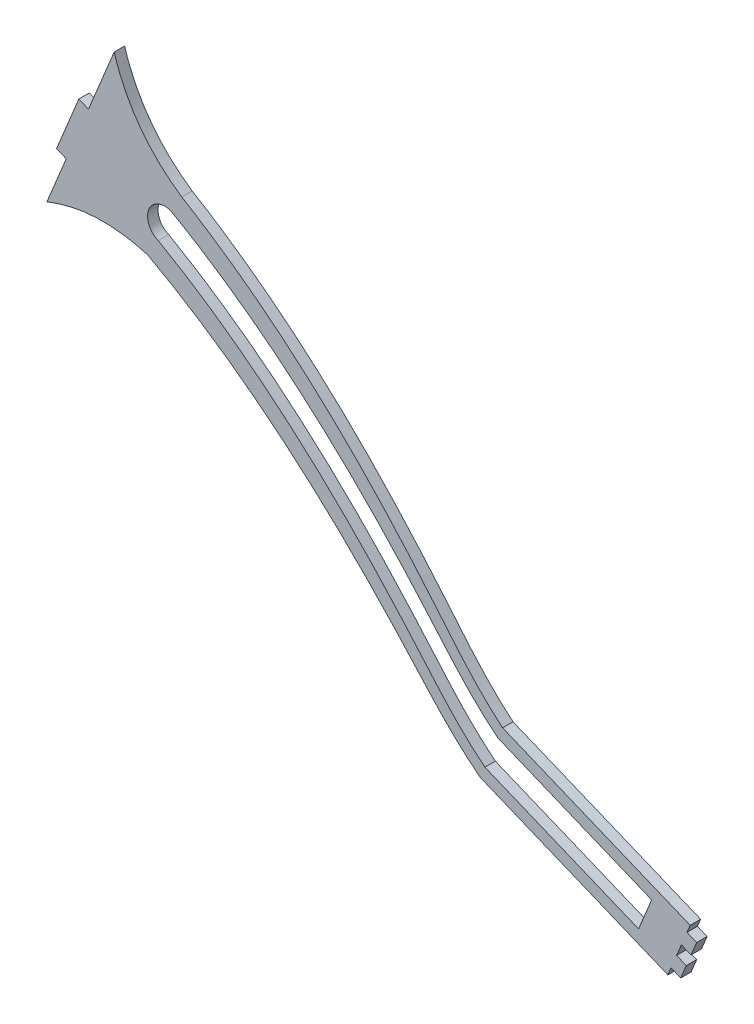
ISO-10303-21;
HEADER;
FILE_DESCRIPTION(('STEP AP214'),'2;1');
FILE_NAME('part.step','',(''),(''),'','','');
FILE_SCHEMA(('AUTOMOTIVE_DESIGN { 1 0 10303 214 1 1 1 1 }'));
ENDSEC;
DATA;
#1=APPLICATION_CONTEXT('core data for automotive mechanical design processes');
#2=APPLICATION_PROTOCOL_DEFINITION('international standard','automotive_design',2000,#1);
#3=PRODUCT_CONTEXT('',#1,'mechanical');
#4=PRODUCT('Part','Part','',(#3));
#5=PRODUCT_RELATED_PRODUCT_CATEGORY('part','',(#4));
#6=PRODUCT_DEFINITION_FORMATION('','',#4);
#7=PRODUCT_DEFINITION_CONTEXT('part definition',#1,'design');
#8=PRODUCT_DEFINITION('design','',#6,#7);
#9=PRODUCT_DEFINITION_SHAPE('','',#8);
#10=(LENGTH_UNIT() NAMED_UNIT(*) SI_UNIT(.MILLI.,.METRE.));
#11=(NAMED_UNIT(*) PLANE_ANGLE_UNIT() SI_UNIT($,.RADIAN.));
#12=(NAMED_UNIT(*) SI_UNIT($,.STERADIAN.) SOLID_ANGLE_UNIT());
#13=UNCERTAINTY_MEASURE_WITH_UNIT(LENGTH_MEASURE(1.E-05),#10,'distance_accuracy_value','');
#14=(GEOMETRIC_REPRESENTATION_CONTEXT(3) GLOBAL_UNCERTAINTY_ASSIGNED_CONTEXT((#13)) GLOBAL_UNIT_ASSIGNED_CONTEXT((#10,
#11,#12)) REPRESENTATION_CONTEXT('',''));
#15=CARTESIAN_POINT('',(0.,0.,0.));
#16=DIRECTION('',(0.,0.,1.));
#17=DIRECTION('',(1.,0.,0.));
#18=AXIS2_PLACEMENT_3D('',#15,#16,#17);
#19=CARTESIAN_POINT('',(72.8165035843439,-45.1124411842966,319.609115736228));
#20=DIRECTION('',(0.924724873269567,-0.380636189499347,0.));
#21=DIRECTION('',(0.380636189499347,0.924724873269567,0.));
#22=AXIS2_PLACEMENT_3D('',#19,#20,#21);
#23=PLANE('',#22);
#24=DIRECTION('',(0.380636189499347,0.924724873269567,0.));
#25=VECTOR('',#24,1.);
#26=CARTESIAN_POINT('',(72.8165035843439,-45.1124411842966,324.609115736228));
#27=LINE('',#26,#25);
#28=CARTESIAN_POINT('',(72.8165035843439,-45.1124411842966,324.609115736228));
#29=VERTEX_POINT('',#28);
#30=CARTESIAN_POINT('',(74.3390483423413,-41.4135416912183,324.609115736228));
#31=VERTEX_POINT('',#30);
#32=EDGE_CURVE('E306',#29,#31,#27,.T.);
#33=ORIENTED_EDGE('',*,*,#32,.F.);
#34=DIRECTION('',(0.,0.,1.));
#35=VECTOR('',#34,1.);
#36=CARTESIAN_POINT('',(72.8165035843439,-45.1124411842966,319.609115736228));
#37=LINE('',#36,#35);
#38=CARTESIAN_POINT('',(72.8165035843439,-45.1124411842966,319.609115736228));
#39=VERTEX_POINT('',#38);
#40=EDGE_CURVE('E11',#39,#29,#37,.T.);
#41=ORIENTED_EDGE('',*,*,#40,.F.);
#42=DIRECTION('',(0.380636189499347,0.924724873269567,0.));
#43=VECTOR('',#42,1.);
#44=CARTESIAN_POINT('',(72.8165035843439,-45.1124411842966,319.609115736228));
#45=LINE('',#44,#43);
#46=CARTESIAN_POINT('',(74.3390483423413,-41.4135416912183,319.609115736228));
#47=VERTEX_POINT('',#46);
#48=EDGE_CURVE('E406',#39,#47,#45,.T.);
#49=ORIENTED_EDGE('',*,*,#48,.T.);
#50=DIRECTION('',(0.,0.,1.));
#51=VECTOR('',#50,1.);
#52=CARTESIAN_POINT('',(74.3390483423413,-41.4135416912183,319.609115736228));
#53=LINE('',#52,#51);
#54=EDGE_CURVE('E46',#47,#31,#53,.T.);
#55=ORIENTED_EDGE('',*,*,#54,.T.);
#56=EDGE_LOOP('',(#33,#41,#49,#55));
#57=FACE_BOUND('',#56,.T.);
#58=ADVANCED_FACE('F43',(#57),#23,.T.);
#59=CARTESIAN_POINT('',(-16.9001284398286,-8.18319018701635,319.609115736228));
#60=DIRECTION('',(-0.380636189499384,-0.924724873269552,0.));
#61=DIRECTION('',(0.924724873269552,-0.380636189499384,0.));
#62=AXIS2_PLACEMENT_3D('',#59,#60,#61);
#63=PLANE('',#62);
#64=DIRECTION('',(0.924724873269552,-0.380636189499384,0.));
#65=VECTOR('',#64,1.);
#66=CARTESIAN_POINT('',(-16.9001284398286,-8.18319018701635,324.609115736228));
#67=LINE('',#66,#65);
#68=CARTESIAN_POINT('',(-16.9001284398286,-8.18319018701635,324.609115736228));
#69=VERTEX_POINT('',#68);
#70=EDGE_CURVE('E400',#69,#29,#67,.T.);
#71=ORIENTED_EDGE('',*,*,#70,.F.);
#72=DIRECTION('',(0.,0.,1.));
#73=VECTOR('',#72,1.);
#74=CARTESIAN_POINT('',(-16.9001284398286,-8.18319018701635,319.609115736228));
#75=LINE('',#74,#73);
#76=CARTESIAN_POINT('',(-16.9001284398286,-8.18319018701635,319.609115736228));
#77=VERTEX_POINT('',#76);
#78=EDGE_CURVE('E52',#77,#69,#75,.T.);
#79=ORIENTED_EDGE('',*,*,#78,.F.);
#80=DIRECTION('',(0.924724873269552,-0.380636189499384,0.));
#81=VECTOR('',#80,1.);
#82=CARTESIAN_POINT('',(-16.9001284398286,-8.18319018701635,319.609115736228));
#83=LINE('',#82,#81);
#84=EDGE_CURVE('E294',#77,#39,#83,.T.);
#85=ORIENTED_EDGE('',*,*,#84,.T.);
#86=ORIENTED_EDGE('',*,*,#40,.T.);
#87=EDGE_LOOP('',(#71,#79,#85,#86));
#88=FACE_BOUND('',#87,.T.);
#89=ADVANCED_FACE('F275',(#88),#63,.T.);
#90=CARTESIAN_POINT('',(-175.911850272844,128.697068334976,319.609115736228));
#91=CARTESIAN_POINT('',(-128.5179558255,102.867060046125,319.609115736228));
#92=CARTESIAN_POINT('',(-75.8520297238942,55.4312582830493,319.609115736228));
#93=CARTESIAN_POINT('',(-30.2221925070831,2.01197393008295,319.609115736228));
#94=CARTESIAN_POINT('',(-16.9001284398324,-8.18319018701298,319.609115736228));
#95=B_SPLINE_CURVE_WITH_KNOTS('',3,(#90,#91,#92,#93,#94),.UNSPECIFIED.,.F.,.F.,(4,1,4),(0.,
0.762851527431731,1.),.UNSPECIFIED.);
#96=DIRECTION('',(0.,0.,1.));
#97=VECTOR('',#96,1.);
#98=SURFACE_OF_LINEAR_EXTRUSION('',#95,#97);
#99=CARTESIAN_POINT('',(-175.911850272844,128.697068334976,324.609115736228));
#100=CARTESIAN_POINT('',(-128.5179558255,102.867060046125,324.609115736228));
#101=CARTESIAN_POINT('',(-75.8520297238942,55.4312582830493,324.609115736228));
#102=CARTESIAN_POINT('',(-30.2221925070831,2.01197393008295,324.609115736228));
#103=CARTESIAN_POINT('',(-16.9001284398324,-8.18319018701298,324.609115736228));
#104=B_SPLINE_CURVE_WITH_KNOTS('',3,(#99,#100,#101,#102,#103),.UNSPECIFIED.,.F.,.F.,(4,1,4),(0.,
0.762851527431731,1.),.UNSPECIFIED.);
#105=CARTESIAN_POINT('',(-175.911850272844,128.697068334976,324.609115736228));
#106=VERTEX_POINT('',#105);
#107=EDGE_CURVE('E391',#106,#69,#104,.T.);
#108=ORIENTED_EDGE('',*,*,#107,.F.);
#109=DIRECTION('',(0.,0.,1.));
#110=VECTOR('',#109,1.);
#111=CARTESIAN_POINT('',(-175.911850272844,128.697068334976,319.609115736228));
#112=LINE('',#111,#110);
#113=CARTESIAN_POINT('',(-175.911850272844,128.697068334976,319.609115736228));
#114=VERTEX_POINT('',#113);
#115=EDGE_CURVE('E410',#114,#106,#112,.T.);
#116=ORIENTED_EDGE('',*,*,#115,.F.);
#117=EDGE_CURVE('E287',#114,#77,#95,.T.);
#118=ORIENTED_EDGE('',*,*,#117,.T.);
#119=ORIENTED_EDGE('',*,*,#78,.T.);
#120=EDGE_LOOP('',(#108,#116,#118,#119));
#121=FACE_BOUND('',#120,.T.);
#122=ADVANCED_FACE('F278',(#121),#98,.T.);
#123=CARTESIAN_POINT('',(-224.182907520058,126.592874832316,319.609115736228));
#124=CARTESIAN_POINT('',(-200.797987468874,136.066038880565,319.609115736228));
#125=CARTESIAN_POINT('',(-175.911850272844,128.697068334976,319.609115736228));
#126=B_SPLINE_CURVE_WITH_KNOTS('',2,(#123,#124,#125),.UNSPECIFIED.,.F.,.F.,(3,3),(0.,1.),.UNSPECIFIED.);
#127=DIRECTION('',(0.,0.,1.));
#128=VECTOR('',#127,1.);
#129=SURFACE_OF_LINEAR_EXTRUSION('',#126,#128);
#130=CARTESIAN_POINT('',(-224.182907520058,126.592874832316,324.609115736228));
#131=CARTESIAN_POINT('',(-200.797987468874,136.066038880565,324.609115736228));
#132=CARTESIAN_POINT('',(-175.911850272844,128.697068334976,324.609115736228));
#133=B_SPLINE_CURVE_WITH_KNOTS('',2,(#130,#131,#132),.UNSPECIFIED.,.F.,.F.,(3,3),(0.,1.),.UNSPECIFIED.);
#134=CARTESIAN_POINT('',(-224.182907520058,126.592874832316,324.609115736228));
#135=VERTEX_POINT('',#134);
#136=EDGE_CURVE('E385',#135,#106,#133,.T.);
#137=ORIENTED_EDGE('',*,*,#136,.F.);
#138=DIRECTION('',(0.,0.,1.));
#139=VECTOR('',#138,1.);
#140=CARTESIAN_POINT('',(-224.182907520058,126.592874832316,319.609115736228));
#141=LINE('',#140,#139);
#142=CARTESIAN_POINT('',(-224.182907520058,126.592874832316,319.609115736228));
#143=VERTEX_POINT('',#142);
#144=EDGE_CURVE('E413',#143,#135,#141,.T.);
#145=ORIENTED_EDGE('',*,*,#144,.F.);
#146=EDGE_CURVE('E295',#143,#114,#126,.T.);
#147=ORIENTED_EDGE('',*,*,#146,.T.);
#148=ORIENTED_EDGE('',*,*,#115,.T.);
#149=EDGE_LOOP('',(#137,#145,#147,#148));
#150=FACE_BOUND('',#149,.T.);
#151=ADVANCED_FACE('F283',(#150),#129,.T.);
#152=CARTESIAN_POINT('',(-224.182907520058,126.592874832316,319.609115736228));
#153=DIRECTION('',(-0.924724873269552,0.380636189499385,0.));
#154=DIRECTION('',(-0.380636189499385,-0.924724873269552,0.));
#155=AXIS2_PLACEMENT_3D('',#152,#153,#154);
#156=PLANE('',#155);
#157=DIRECTION('',(-0.380636189499385,-0.924724873269552,0.));
#158=VECTOR('',#157,1.);
#159=CARTESIAN_POINT('',(-224.182907520058,126.592874832316,324.609115736228));
#160=LINE('',#159,#158);
#161=CARTESIAN_POINT('',(-214.945420062279,149.034604374529,324.609115736228));
#162=VERTEX_POINT('',#161);
#163=EDGE_CURVE('E381',#162,#135,#160,.T.);
#164=ORIENTED_EDGE('',*,*,#163,.F.);
#165=DIRECTION('',(0.,0.,1.));
#166=VECTOR('',#165,1.);
#167=CARTESIAN_POINT('',(-214.945420062279,149.034604374529,319.609115736228));
#168=LINE('',#167,#166);
#169=CARTESIAN_POINT('',(-214.945420062279,149.034604374529,319.609115736228));
#170=VERTEX_POINT('',#169);
#171=EDGE_CURVE('E416',#170,#162,#168,.T.);
#172=ORIENTED_EDGE('',*,*,#171,.F.);
#173=DIRECTION('',(-0.380636189499385,-0.924724873269552,0.));
#174=VECTOR('',#173,1.);
#175=CARTESIAN_POINT('',(-224.182907520058,126.592874832316,319.609115736228));
#176=LINE('',#175,#174);
#177=EDGE_CURVE('E918',#170,#143,#176,.T.);
#178=ORIENTED_EDGE('',*,*,#177,.T.);
#179=ORIENTED_EDGE('',*,*,#144,.T.);
#180=EDGE_LOOP('',(#164,#172,#178,#179));
#181=FACE_BOUND('',#180,.T.);
#182=ADVANCED_FACE('F588',(#181),#156,.T.);
#183=CARTESIAN_POINT('',(-219.569044428627,150.937785322026,319.609115736228));
#184=DIRECTION('',(-0.380636189499384,-0.924724873269552,0.));
#185=DIRECTION('',(0.924724873269552,-0.380636189499384,0.));
#186=AXIS2_PLACEMENT_3D('',#183,#184,#185);
#187=PLANE('',#186);
#188=DIRECTION('',(0.924724873269552,-0.380636189499384,0.));
#189=VECTOR('',#188,1.);
#190=CARTESIAN_POINT('',(-219.569044428627,150.937785322026,324.609115736228));
#191=LINE('',#190,#189);
#192=CARTESIAN_POINT('',(-219.569044428627,150.937785322026,324.609115736228));
#193=VERTEX_POINT('',#192);
#194=EDGE_CURVE('E377',#193,#162,#191,.T.);
#195=ORIENTED_EDGE('',*,*,#194,.F.);
#196=DIRECTION('',(0.,0.,1.));
#197=VECTOR('',#196,1.);
#198=CARTESIAN_POINT('',(-219.569044428627,150.937785322026,319.609115736228));
#199=LINE('',#198,#197);
#200=CARTESIAN_POINT('',(-219.569044428627,150.937785322026,319.609115736228));
#201=VERTEX_POINT('',#200);
#202=EDGE_CURVE('E419',#201,#193,#199,.T.);
#203=ORIENTED_EDGE('',*,*,#202,.F.);
#204=DIRECTION('',(0.924724873269552,-0.380636189499384,0.));
#205=VECTOR('',#204,1.);
#206=CARTESIAN_POINT('',(-219.569044428627,150.937785322026,319.609115736228));
#207=LINE('',#206,#205);
#208=EDGE_CURVE('E915',#201,#170,#207,.T.);
#209=ORIENTED_EDGE('',*,*,#208,.T.);
#210=ORIENTED_EDGE('',*,*,#171,.T.);
#211=EDGE_LOOP('',(#195,#203,#209,#210));
#212=FACE_BOUND('',#211,.T.);
#213=ADVANCED_FACE('F595',(#212),#187,.T.);
#214=CARTESIAN_POINT('',(-219.569044428627,150.937785322026,319.609115736228));
#215=DIRECTION('',(-0.924724873269552,0.380636189499385,0.));
#216=DIRECTION('',(-0.380636189499385,-0.924724873269552,0.));
#217=AXIS2_PLACEMENT_3D('',#214,#215,#216);
#218=PLANE('',#217);
#219=DIRECTION('',(-0.380636189499385,-0.924724873269552,0.));
#220=VECTOR('',#219,1.);
#221=CARTESIAN_POINT('',(-219.569044428627,150.937785322026,324.609115736228));
#222=LINE('',#221,#220);
#223=CARTESIAN_POINT('',(-208.911231122383,176.830081774207,324.609115736228));
#224=VERTEX_POINT('',#223);
#225=EDGE_CURVE('E373',#224,#193,#222,.T.);
#226=ORIENTED_EDGE('',*,*,#225,.F.);
#227=DIRECTION('',(0.,0.,1.));
#228=VECTOR('',#227,1.);
#229=CARTESIAN_POINT('',(-208.911231122383,176.830081774207,319.609115736228));
#230=LINE('',#229,#228);
#231=CARTESIAN_POINT('',(-208.911231122383,176.830081774207,319.609115736228));
#232=VERTEX_POINT('',#231);
#233=EDGE_CURVE('E422',#232,#224,#230,.T.);
#234=ORIENTED_EDGE('',*,*,#233,.F.);
#235=DIRECTION('',(-0.380636189499385,-0.924724873269552,0.));
#236=VECTOR('',#235,1.);
#237=CARTESIAN_POINT('',(-219.569044428627,150.937785322026,319.609115736228));
#238=LINE('',#237,#236);
#239=EDGE_CURVE('E909',#232,#201,#238,.T.);
#240=ORIENTED_EDGE('',*,*,#239,.T.);
#241=ORIENTED_EDGE('',*,*,#202,.T.);
#242=EDGE_LOOP('',(#226,#234,#240,#241));
#243=FACE_BOUND('',#242,.T.);
#244=ADVANCED_FACE('F602',(#243),#218,.T.);
#245=CARTESIAN_POINT('',(-208.911231122383,176.830081774207,319.609115736228));
#246=DIRECTION('',(0.380636189499384,0.924724873269552,0.));
#247=DIRECTION('',(-0.924724873269552,0.380636189499384,0.));
#248=AXIS2_PLACEMENT_3D('',#245,#246,#247);
#249=PLANE('',#248);
#250=DIRECTION('',(-0.924724873269552,0.380636189499384,0.));
#251=VECTOR('',#250,1.);
#252=CARTESIAN_POINT('',(-208.911231122383,176.830081774207,324.609115736228));
#253=LINE('',#252,#251);
#254=CARTESIAN_POINT('',(-204.287606756035,174.92690082671,324.609115736228));
#255=VERTEX_POINT('',#254);
#256=EDGE_CURVE('E369',#255,#224,#253,.T.);
#257=ORIENTED_EDGE('',*,*,#256,.F.);
#258=DIRECTION('',(0.,0.,1.));
#259=VECTOR('',#258,1.);
#260=CARTESIAN_POINT('',(-204.287606756035,174.92690082671,319.609115736228));
#261=LINE('',#260,#259);
#262=CARTESIAN_POINT('',(-204.287606756035,174.92690082671,319.609115736228));
#263=VERTEX_POINT('',#262);
#264=EDGE_CURVE('E425',#263,#255,#261,.T.);
#265=ORIENTED_EDGE('',*,*,#264,.F.);
#266=DIRECTION('',(-0.924724873269552,0.380636189499384,0.));
#267=VECTOR('',#266,1.);
#268=CARTESIAN_POINT('',(-208.911231122383,176.830081774207,319.609115736228));
#269=LINE('',#268,#267);
#270=EDGE_CURVE('E906',#263,#232,#269,.T.);
#271=ORIENTED_EDGE('',*,*,#270,.T.);
#272=ORIENTED_EDGE('',*,*,#233,.T.);
#273=EDGE_LOOP('',(#257,#265,#271,#272));
#274=FACE_BOUND('',#273,.T.);
#275=ADVANCED_FACE('F610',(#274),#249,.T.);
#276=CARTESIAN_POINT('',(-204.287606756035,174.92690082671,319.609115736228));
#277=DIRECTION('',(-0.924724873269552,0.380636189499384,0.));
#278=DIRECTION('',(-0.380636189499384,-0.924724873269552,0.));
#279=AXIS2_PLACEMENT_3D('',#276,#277,#278);
#280=PLANE('',#279);
#281=DIRECTION('',(-0.380636189499384,-0.924724873269552,0.));
#282=VECTOR('',#281,1.);
#283=CARTESIAN_POINT('',(-204.287606756035,174.92690082671,324.609115736228));
#284=LINE('',#283,#282);
#285=CARTESIAN_POINT('',(-192.022205470725,204.724702407469,324.609115736228));
#286=VERTEX_POINT('',#285);
#287=EDGE_CURVE('E362',#286,#255,#284,.T.);
#288=ORIENTED_EDGE('',*,*,#287,.F.);
#289=DIRECTION('',(0.,0.,1.));
#290=VECTOR('',#289,1.);
#291=CARTESIAN_POINT('',(-192.022205470725,204.724702407469,319.609115736228));
#292=LINE('',#291,#290);
#293=CARTESIAN_POINT('',(-192.022205470725,204.724702407469,319.609115736228));
#294=VERTEX_POINT('',#293);
#295=EDGE_CURVE('E428',#294,#286,#292,.T.);
#296=ORIENTED_EDGE('',*,*,#295,.F.);
#297=DIRECTION('',(-0.380636189499384,-0.924724873269552,0.));
#298=VECTOR('',#297,1.);
#299=CARTESIAN_POINT('',(-204.287606756035,174.92690082671,319.609115736228));
#300=LINE('',#299,#298);
#301=EDGE_CURVE('E903',#294,#263,#300,.T.);
#302=ORIENTED_EDGE('',*,*,#301,.T.);
#303=ORIENTED_EDGE('',*,*,#264,.T.);
#304=EDGE_LOOP('',(#288,#296,#302,#303));
#305=FACE_BOUND('',#304,.T.);
#306=ADVANCED_FACE('F618',(#305),#280,.T.);
#307=CARTESIAN_POINT('',(-159.667254414533,160.823469135802,319.609115736228));
#308=CARTESIAN_POINT('',(-183.525718418894,177.076811357464,319.609115736228));
#309=CARTESIAN_POINT('',(-192.022205470725,204.724702407469,319.609115736228));
#310=B_SPLINE_CURVE_WITH_KNOTS('',2,(#307,#308,#309),.UNSPECIFIED.,.F.,.F.,(3,3),(0.,1.),.UNSPECIFIED.);
#311=DIRECTION('',(0.,0.,1.));
#312=VECTOR('',#311,1.);
#313=SURFACE_OF_LINEAR_EXTRUSION('',#310,#312);
#314=CARTESIAN_POINT('',(-159.667254414533,160.823469135802,324.609115736228));
#315=CARTESIAN_POINT('',(-183.525718418894,177.076811357464,324.609115736228));
#316=CARTESIAN_POINT('',(-192.022205470725,204.724702407469,324.609115736228));
#317=B_SPLINE_CURVE_WITH_KNOTS('',2,(#314,#315,#316),.UNSPECIFIED.,.F.,.F.,(3,3),(0.,1.),.UNSPECIFIED.);
#318=CARTESIAN_POINT('',(-159.667254414533,160.823469135802,324.609115736228));
#319=VERTEX_POINT('',#318);
#320=EDGE_CURVE('E353',#319,#286,#317,.T.);
#321=ORIENTED_EDGE('',*,*,#320,.F.);
#322=DIRECTION('',(0.,0.,1.));
#323=VECTOR('',#322,1.);
#324=CARTESIAN_POINT('',(-159.667254414533,160.823469135802,319.609115736228));
#325=LINE('',#324,#323);
#326=CARTESIAN_POINT('',(-159.667254414533,160.823469135802,319.609115736228));
#327=VERTEX_POINT('',#326);
#328=EDGE_CURVE('E431',#327,#319,#325,.T.);
#329=ORIENTED_EDGE('',*,*,#328,.F.);
#330=EDGE_CURVE('E521',#327,#294,#310,.T.);
#331=ORIENTED_EDGE('',*,*,#330,.T.);
#332=ORIENTED_EDGE('',*,*,#295,.T.);
#333=EDGE_LOOP('',(#321,#329,#331,#332));
#334=FACE_BOUND('',#333,.T.);
#335=ADVANCED_FACE('F535',(#334),#313,.T.);
#336=CARTESIAN_POINT('',(-6.24231513388083,17.7091062644463,319.609115736228));
#337=CARTESIAN_POINT('',(-19.1470856782684,28.4275790839837,319.609115736228));
#338=CARTESIAN_POINT('',(-62.6096835936194,83.6245406639863,319.609115736228));
#339=CARTESIAN_POINT('',(-113.341454037557,133.123455083084,319.609115736228));
#340=CARTESIAN_POINT('',(-159.667254414533,160.823469135802,319.609115736228));
#341=B_SPLINE_CURVE_WITH_KNOTS('',3,(#336,#337,#338,#339,#340),.UNSPECIFIED.,.F.,.F.,(4,1,4),
(0.,0.237148472568269,1.),.UNSPECIFIED.);
#342=DIRECTION('',(0.,0.,1.));
#343=VECTOR('',#342,1.);
#344=SURFACE_OF_LINEAR_EXTRUSION('',#341,#343);
#345=CARTESIAN_POINT('',(-6.24231513388083,17.7091062644463,324.609115736228));
#346=CARTESIAN_POINT('',(-19.1470856782684,28.4275790839837,324.609115736228));
#347=CARTESIAN_POINT('',(-62.6096835936194,83.6245406639863,324.609115736228));
#348=CARTESIAN_POINT('',(-113.341454037557,133.123455083084,324.609115736228));
#349=CARTESIAN_POINT('',(-159.667254414533,160.823469135802,324.609115736228));
#350=B_SPLINE_CURVE_WITH_KNOTS('',3,(#345,#346,#347,#348,#349),.UNSPECIFIED.,.F.,.F.,(4,1,4),
(0.,0.237148472568269,1.),.UNSPECIFIED.);
#351=CARTESIAN_POINT('',(-6.24231513388083,17.7091062644463,324.609115736228));
#352=VERTEX_POINT('',#351);
#353=EDGE_CURVE('E347',#352,#319,#350,.T.);
#354=ORIENTED_EDGE('',*,*,#353,.F.);
#355=DIRECTION('',(0.,0.,1.));
#356=VECTOR('',#355,1.);
#357=CARTESIAN_POINT('',(-6.24231513388083,17.7091062644463,319.609115736228));
#358=LINE('',#357,#356);
#359=CARTESIAN_POINT('',(-6.24231513388083,17.7091062644463,319.609115736228));
#360=VERTEX_POINT('',#359);
#361=EDGE_CURVE('E434',#360,#352,#358,.T.);
#362=ORIENTED_EDGE('',*,*,#361,.F.);
#363=EDGE_CURVE('E514',#360,#327,#341,.T.);
#364=ORIENTED_EDGE('',*,*,#363,.T.);
#365=ORIENTED_EDGE('',*,*,#328,.T.);
#366=EDGE_LOOP('',(#354,#362,#364,#365));
#367=FACE_BOUND('',#366,.T.);
#368=ADVANCED_FACE('F530',(#367),#344,.T.);
#369=CARTESIAN_POINT('',(83.4743168902917,-19.2201447328341,319.609115736228));
#370=DIRECTION('',(0.380636189499385,0.924724873269551,0.));
#371=DIRECTION('',(-0.924724873269552,0.380636189499385,0.));
#372=AXIS2_PLACEMENT_3D('',#369,#370,#371);
#373=PLANE('',#372);
#374=DIRECTION('',(-0.924724873269551,0.380636189499385,0.));
#375=VECTOR('',#374,1.);
#376=CARTESIAN_POINT('',(83.4743168902917,-19.2201447328341,324.609115736228));
#377=LINE('',#376,#375);
#378=CARTESIAN_POINT('',(83.4743168902917,-19.2201447328341,324.609115736228));
#379=VERTEX_POINT('',#378);
#380=EDGE_CURVE('E343',#379,#352,#377,.T.);
#381=ORIENTED_EDGE('',*,*,#380,.F.);
#382=DIRECTION('',(0.,0.,1.));
#383=VECTOR('',#382,1.);
#384=CARTESIAN_POINT('',(83.4743168902917,-19.2201447328341,319.609115736228));
#385=LINE('',#384,#383);
#386=CARTESIAN_POINT('',(83.4743168902917,-19.2201447328341,319.609115736228));
#387=VERTEX_POINT('',#386);
#388=EDGE_CURVE('E437',#387,#379,#385,.T.);
#389=ORIENTED_EDGE('',*,*,#388,.F.);
#390=DIRECTION('',(-0.924724873269551,0.380636189499385,0.));
#391=VECTOR('',#390,1.);
#392=CARTESIAN_POINT('',(83.4743168902917,-19.2201447328341,319.609115736228));
#393=LINE('',#392,#391);
#394=EDGE_CURVE('E510',#387,#360,#393,.T.);
#395=ORIENTED_EDGE('',*,*,#394,.T.);
#396=ORIENTED_EDGE('',*,*,#361,.T.);
#397=EDGE_LOOP('',(#381,#389,#395,#396));
#398=FACE_BOUND('',#397,.T.);
#399=ADVANCED_FACE('F534',(#398),#373,.T.);
#400=CARTESIAN_POINT('',(81.9517721322942,-22.9190442259123,319.609115736228));
#401=DIRECTION('',(0.924724873269552,-0.380636189499385,0.));
#402=DIRECTION('',(0.380636189499385,0.924724873269552,0.));
#403=AXIS2_PLACEMENT_3D('',#400,#401,#402);
#404=PLANE('',#403);
#405=DIRECTION('',(0.380636189499385,0.924724873269552,0.));
#406=VECTOR('',#405,1.);
#407=CARTESIAN_POINT('',(81.9517721322942,-22.9190442259123,324.609115736228));
#408=LINE('',#407,#406);
#409=CARTESIAN_POINT('',(81.9517721322942,-22.9190442259123,324.609115736228));
#410=VERTEX_POINT('',#409);
#411=EDGE_CURVE('E339',#410,#379,#408,.T.);
#412=ORIENTED_EDGE('',*,*,#411,.F.);
#413=DIRECTION('',(0.,0.,1.));
#414=VECTOR('',#413,1.);
#415=CARTESIAN_POINT('',(81.9517721322942,-22.9190442259123,319.609115736228));
#416=LINE('',#415,#414);
#417=CARTESIAN_POINT('',(81.9517721322942,-22.9190442259123,319.609115736228));
#418=VERTEX_POINT('',#417);
#419=EDGE_CURVE('E440',#418,#410,#416,.T.);
#420=ORIENTED_EDGE('',*,*,#419,.F.);
#421=DIRECTION('',(0.380636189499385,0.924724873269552,0.));
#422=VECTOR('',#421,1.);
#423=CARTESIAN_POINT('',(81.9517721322942,-22.9190442259123,319.609115736228));
#424=LINE('',#423,#422);
#425=EDGE_CURVE('E506',#418,#387,#424,.T.);
#426=ORIENTED_EDGE('',*,*,#425,.T.);
#427=ORIENTED_EDGE('',*,*,#388,.T.);
#428=EDGE_LOOP('',(#412,#420,#426,#427));
#429=FACE_BOUND('',#428,.T.);
#430=ADVANCED_FACE('F540',(#429),#404,.T.);
#431=CARTESIAN_POINT('',(86.5753964986418,-24.8222251734091,319.609115736228));
#432=DIRECTION('',(0.380636189499385,0.924724873269552,0.));
#433=DIRECTION('',(-0.924724873269552,0.380636189499385,0.));
#434=AXIS2_PLACEMENT_3D('',#431,#432,#433);
#435=PLANE('',#434);
#436=DIRECTION('',(-0.924724873269552,0.380636189499385,0.));
#437=VECTOR('',#436,1.);
#438=CARTESIAN_POINT('',(86.5753964986418,-24.8222251734091,324.609115736228));
#439=LINE('',#438,#437);
#440=CARTESIAN_POINT('',(86.5753964986418,-24.8222251734091,324.609115736228));
#441=VERTEX_POINT('',#440);
#442=EDGE_CURVE('E335',#441,#410,#439,.T.);
#443=ORIENTED_EDGE('',*,*,#442,.F.);
#444=DIRECTION('',(0.,0.,1.));
#445=VECTOR('',#444,1.);
#446=CARTESIAN_POINT('',(86.5753964986418,-24.8222251734091,319.609115736228));
#447=LINE('',#446,#445);
#448=CARTESIAN_POINT('',(86.5753964986418,-24.8222251734091,319.609115736228));
#449=VERTEX_POINT('',#448);
#450=EDGE_CURVE('E443',#449,#441,#447,.T.);
#451=ORIENTED_EDGE('',*,*,#450,.F.);
#452=DIRECTION('',(-0.924724873269552,0.380636189499385,0.));
#453=VECTOR('',#452,1.);
#454=CARTESIAN_POINT('',(86.5753964986418,-24.8222251734091,319.609115736228));
#455=LINE('',#454,#453);
#456=EDGE_CURVE('E502',#449,#418,#455,.T.);
#457=ORIENTED_EDGE('',*,*,#456,.T.);
#458=ORIENTED_EDGE('',*,*,#419,.T.);
#459=EDGE_LOOP('',(#443,#451,#457,#458));
#460=FACE_BOUND('',#459,.T.);
#461=ADVANCED_FACE('F544',(#460),#435,.T.);
#462=CARTESIAN_POINT('',(83.9109431721461,-31.295299286296,319.609115736228));
#463=DIRECTION('',(0.924724873269551,-0.380636189499386,0.));
#464=DIRECTION('',(0.380636189499386,0.924724873269551,0.));
#465=AXIS2_PLACEMENT_3D('',#462,#463,#464);
#466=PLANE('',#465);
#467=DIRECTION('',(0.380636189499386,0.924724873269551,0.));
#468=VECTOR('',#467,1.);
#469=CARTESIAN_POINT('',(83.9109431721461,-31.295299286296,324.609115736228));
#470=LINE('',#469,#468);
#471=CARTESIAN_POINT('',(83.9109431721461,-31.295299286296,324.609115736228));
#472=VERTEX_POINT('',#471);
#473=EDGE_CURVE('E331',#472,#441,#470,.T.);
#474=ORIENTED_EDGE('',*,*,#473,.F.);
#475=DIRECTION('',(0.,0.,1.));
#476=VECTOR('',#475,1.);
#477=CARTESIAN_POINT('',(83.9109431721461,-31.295299286296,319.609115736228));
#478=LINE('',#477,#476);
#479=CARTESIAN_POINT('',(83.9109431721461,-31.295299286296,319.609115736228));
#480=VERTEX_POINT('',#479);
#481=EDGE_CURVE('E446',#480,#472,#478,.T.);
#482=ORIENTED_EDGE('',*,*,#481,.F.);
#483=DIRECTION('',(0.380636189499386,0.924724873269551,0.));
#484=VECTOR('',#483,1.);
#485=CARTESIAN_POINT('',(83.9109431721461,-31.295299286296,319.609115736228));
#486=LINE('',#485,#484);
#487=EDGE_CURVE('E498',#480,#449,#486,.T.);
#488=ORIENTED_EDGE('',*,*,#487,.T.);
#489=ORIENTED_EDGE('',*,*,#450,.T.);
#490=EDGE_LOOP('',(#474,#482,#488,#489));
#491=FACE_BOUND('',#490,.T.);
#492=ADVANCED_FACE('F548',(#491),#466,.T.);
#493=CARTESIAN_POINT('',(79.2873188057983,-29.3921183387991,319.609115736228));
#494=DIRECTION('',(-0.380636189499386,-0.924724873269551,0.));
#495=DIRECTION('',(0.924724873269551,-0.380636189499386,0.));
#496=AXIS2_PLACEMENT_3D('',#493,#494,#495);
#497=PLANE('',#496);
#498=DIRECTION('',(0.924724873269551,-0.380636189499386,0.));
#499=VECTOR('',#498,1.);
#500=CARTESIAN_POINT('',(79.2873188057983,-29.3921183387991,324.609115736228));
#501=LINE('',#500,#499);
#502=CARTESIAN_POINT('',(79.2873188057983,-29.3921183387991,324.609115736228));
#503=VERTEX_POINT('',#502);
#504=EDGE_CURVE('E327',#503,#472,#501,.T.);
#505=ORIENTED_EDGE('',*,*,#504,.F.);
#506=DIRECTION('',(0.,0.,1.));
#507=VECTOR('',#506,1.);
#508=CARTESIAN_POINT('',(79.2873188057983,-29.3921183387991,319.609115736228));
#509=LINE('',#508,#507);
#510=CARTESIAN_POINT('',(79.2873188057983,-29.3921183387991,319.609115736228));
#511=VERTEX_POINT('',#510);
#512=EDGE_CURVE('E449',#511,#503,#509,.T.);
#513=ORIENTED_EDGE('',*,*,#512,.F.);
#514=DIRECTION('',(0.924724873269551,-0.380636189499386,0.));
#515=VECTOR('',#514,1.);
#516=CARTESIAN_POINT('',(79.2873188057983,-29.3921183387991,319.609115736228));
#517=LINE('',#516,#515);
#518=EDGE_CURVE('E494',#511,#480,#517,.T.);
#519=ORIENTED_EDGE('',*,*,#518,.T.);
#520=ORIENTED_EDGE('',*,*,#481,.T.);
#521=EDGE_LOOP('',(#505,#513,#519,#520));
#522=FACE_BOUND('',#521,.T.);
#523=ADVANCED_FACE('F552',(#522),#497,.T.);
#524=CARTESIAN_POINT('',(77.0035016688371,-34.9404675783315,319.609115736228));
#525=DIRECTION('',(0.924724873269561,-0.380636189499363,0.));
#526=DIRECTION('',(0.380636189499363,0.924724873269561,0.));
#527=AXIS2_PLACEMENT_3D('',#524,#525,#526);
#528=PLANE('',#527);
#529=DIRECTION('',(0.380636189499363,0.924724873269561,0.));
#530=VECTOR('',#529,1.);
#531=CARTESIAN_POINT('',(77.0035016688371,-34.9404675783315,324.609115736228));
#532=LINE('',#531,#530);
#533=CARTESIAN_POINT('',(77.0035016688371,-34.9404675783315,324.609115736228));
#534=VERTEX_POINT('',#533);
#535=EDGE_CURVE('E323',#534,#503,#532,.T.);
#536=ORIENTED_EDGE('',*,*,#535,.F.);
#537=DIRECTION('',(0.,0.,1.));
#538=VECTOR('',#537,1.);
#539=CARTESIAN_POINT('',(77.0035016688371,-34.9404675783315,319.609115736228));
#540=LINE('',#539,#538);
#541=CARTESIAN_POINT('',(77.0035016688371,-34.9404675783315,319.609115736228));
#542=VERTEX_POINT('',#541);
#543=EDGE_CURVE('E452',#542,#534,#540,.T.);
#544=ORIENTED_EDGE('',*,*,#543,.F.);
#545=DIRECTION('',(0.380636189499363,0.924724873269561,0.));
#546=VECTOR('',#545,1.);
#547=CARTESIAN_POINT('',(77.0035016688371,-34.9404675783315,319.609115736228));
#548=LINE('',#547,#546);
#549=EDGE_CURVE('E490',#542,#511,#548,.T.);
#550=ORIENTED_EDGE('',*,*,#549,.T.);
#551=ORIENTED_EDGE('',*,*,#512,.T.);
#552=EDGE_LOOP('',(#536,#544,#550,#551));
#553=FACE_BOUND('',#552,.T.);
#554=ADVANCED_FACE('F556',(#553),#528,.T.);
#555=CARTESIAN_POINT('',(81.6271260351845,-36.8436485258282,319.609115736228));
#556=DIRECTION('',(0.380636189499383,0.924724873269553,0.));
#557=DIRECTION('',(-0.924724873269553,0.380636189499383,0.));
#558=AXIS2_PLACEMENT_3D('',#555,#556,#557);
#559=PLANE('',#558);
#560=DIRECTION('',(-0.924724873269553,0.380636189499383,0.));
#561=VECTOR('',#560,1.);
#562=CARTESIAN_POINT('',(81.6271260351845,-36.8436485258282,324.609115736228));
#563=LINE('',#562,#561);
#564=CARTESIAN_POINT('',(81.6271260351845,-36.8436485258282,324.609115736228));
#565=VERTEX_POINT('',#564);
#566=EDGE_CURVE('E319',#565,#534,#563,.T.);
#567=ORIENTED_EDGE('',*,*,#566,.F.);
#568=DIRECTION('',(0.,0.,1.));
#569=VECTOR('',#568,1.);
#570=CARTESIAN_POINT('',(81.6271260351845,-36.8436485258282,319.609115736228));
#571=LINE('',#570,#569);
#572=CARTESIAN_POINT('',(81.6271260351845,-36.8436485258282,319.609115736228));
#573=VERTEX_POINT('',#572);
#574=EDGE_CURVE('E455',#573,#565,#571,.T.);
#575=ORIENTED_EDGE('',*,*,#574,.F.);
#576=DIRECTION('',(-0.924724873269553,0.380636189499383,0.));
#577=VECTOR('',#576,1.);
#578=CARTESIAN_POINT('',(81.6271260351845,-36.8436485258282,319.609115736228));
#579=LINE('',#578,#577);
#580=EDGE_CURVE('E486',#573,#542,#579,.T.);
#581=ORIENTED_EDGE('',*,*,#580,.T.);
#582=ORIENTED_EDGE('',*,*,#543,.T.);
#583=EDGE_LOOP('',(#567,#575,#581,#582));
#584=FACE_BOUND('',#583,.T.);
#585=ADVANCED_FACE('F560',(#584),#559,.T.);
#586=CARTESIAN_POINT('',(78.962672708689,-43.3167226387151,319.609115736228));
#587=DIRECTION('',(0.924724873269559,-0.380636189499366,0.));
#588=DIRECTION('',(0.380636189499366,0.924724873269559,0.));
#589=AXIS2_PLACEMENT_3D('',#586,#587,#588);
#590=PLANE('',#589);
#591=DIRECTION('',(0.380636189499366,0.924724873269559,0.));
#592=VECTOR('',#591,1.);
#593=CARTESIAN_POINT('',(78.962672708689,-43.3167226387151,324.609115736228));
#594=LINE('',#593,#592);
#595=CARTESIAN_POINT('',(78.962672708689,-43.3167226387151,324.609115736228));
#596=VERTEX_POINT('',#595);
#597=EDGE_CURVE('E315',#596,#565,#594,.T.);
#598=ORIENTED_EDGE('',*,*,#597,.F.);
#599=DIRECTION('',(0.,0.,1.));
#600=VECTOR('',#599,1.);
#601=CARTESIAN_POINT('',(78.962672708689,-43.3167226387151,319.609115736228));
#602=LINE('',#601,#600);
#603=CARTESIAN_POINT('',(78.962672708689,-43.3167226387151,319.609115736228));
#604=VERTEX_POINT('',#603);
#605=EDGE_CURVE('E457',#604,#596,#602,.T.);
#606=ORIENTED_EDGE('',*,*,#605,.F.);
#607=DIRECTION('',(0.380636189499366,0.924724873269559,0.));
#608=VECTOR('',#607,1.);
#609=CARTESIAN_POINT('',(78.962672708689,-43.3167226387151,319.609115736228));
#610=LINE('',#609,#608);
#611=EDGE_CURVE('E479',#604,#573,#610,.T.);
#612=ORIENTED_EDGE('',*,*,#611,.T.);
#613=ORIENTED_EDGE('',*,*,#574,.T.);
#614=EDGE_LOOP('',(#598,#606,#612,#613));
#615=FACE_BOUND('',#614,.T.);
#616=ADVANCED_FACE('F564',(#615),#590,.T.);
#617=CARTESIAN_POINT('',(74.3390483423413,-41.4135416912183,319.609115736228));
#618=DIRECTION('',(-0.380636189499365,-0.92472487326956,0.));
#619=DIRECTION('',(0.92472487326956,-0.380636189499365,0.));
#620=AXIS2_PLACEMENT_3D('',#617,#618,#619);
#621=PLANE('',#620);
#622=DIRECTION('',(0.92472487326956,-0.380636189499365,0.));
#623=VECTOR('',#622,1.);
#624=CARTESIAN_POINT('',(74.3390483423413,-41.4135416912183,324.609115736228));
#625=LINE('',#624,#623);
#626=EDGE_CURVE('E310',#31,#596,#625,.T.);
#627=ORIENTED_EDGE('',*,*,#626,.F.);
#628=ORIENTED_EDGE('',*,*,#54,.F.);
#629=DIRECTION('',(0.92472487326956,-0.380636189499365,0.));
#630=VECTOR('',#629,1.);
#631=CARTESIAN_POINT('',(74.3390483423413,-41.4135416912183,319.609115736228));
#632=LINE('',#631,#630);
#633=EDGE_CURVE('E475',#47,#604,#632,.T.);
#634=ORIENTED_EDGE('',*,*,#633,.T.);
#635=ORIENTED_EDGE('',*,*,#605,.T.);
#636=EDGE_LOOP('',(#627,#628,#634,#635));
#637=FACE_BOUND('',#636,.T.);
#638=ADVANCED_FACE('F271',(#637),#621,.T.);
#639=CARTESIAN_POINT('',(-77.4476509112392,95.2901801398376,319.609115736228));
#640=DIRECTION('',(0.,0.,1.));
#641=DIRECTION('',(1.,0.,0.));
#642=AXIS2_PLACEMENT_3D('',#639,#640,#641);
#643=PLANE('',#642);
#644=DIRECTION('',(0.924724873269552,-0.380636189499384,0.));
#645=VECTOR('',#644,1.);
#646=CARTESIAN_POINT('',(-14.6924385407263,-2.81978592203824,319.609115736228));
#647=LINE('',#646,#645);
#648=CARTESIAN_POINT('',(-14.6924385407263,-2.81978592203824,319.609115736228));
#649=VERTEX_POINT('',#648);
#650=CARTESIAN_POINT('',(58.8073249644412,-33.0738330645096,319.609115736228));
#651=VERTEX_POINT('',#650);
#652=EDGE_CURVE('E226',#649,#651,#647,.T.);
#653=ORIENTED_EDGE('',*,*,#652,.T.);
#654=DIRECTION('',(0.380636189499385,0.924724873269551,0.));
#655=VECTOR('',#654,1.);
#656=CARTESIAN_POINT('',(58.8073249644412,-33.0738330645096,319.609115736228));
#657=LINE('',#656,#655);
#658=CARTESIAN_POINT('',(65.0497584721976,-17.9083451429705,319.609115736228));
#659=VERTEX_POINT('',#658);
#660=EDGE_CURVE('E219',#651,#659,#657,.T.);
#661=ORIENTED_EDGE('',*,*,#660,.T.);
#662=DIRECTION('',(-0.924724873269552,0.380636189499386,0.));
#663=VECTOR('',#662,1.);
#664=CARTESIAN_POINT('',(65.0497584721976,-17.9083451429705,319.609115736228));
#665=LINE('',#664,#663);
#666=CARTESIAN_POINT('',(-8.4500050329698,12.3457019995009,319.609115736228));
#667=VERTEX_POINT('',#666);
#668=EDGE_CURVE('E229',#659,#667,#665,.T.);
#669=ORIENTED_EDGE('',*,*,#668,.T.);
#670=CARTESIAN_POINT('',(-8.45000503296981,12.3457019995009,319.609115736228));
#671=CARTESIAN_POINT('',(-21.566591824105,22.803900378608,319.609115736228));
#672=CARTESIAN_POINT('',(-66.1245810186235,77.1204501967937,319.609115736228));
#673=CARTESIAN_POINT('',(-117.836312175411,125.594689972246,319.609115736228));
#674=CARTESIAN_POINT('',(-164.706918419589,152.362521961188,319.609115736228));
#675=B_SPLINE_CURVE_WITH_KNOTS('',3,(#670,#671,#672,#673,#674),.UNSPECIFIED.,.F.,.F.,(4,1,4),
(0.,0.237148472568269,1.),.UNSPECIFIED.);
#676=CARTESIAN_POINT('',(-164.706918419589,152.362521961188,319.609115736228));
#677=VERTEX_POINT('',#676);
#678=EDGE_CURVE('E60',#667,#677,#675,.T.);
#679=ORIENTED_EDGE('',*,*,#678,.T.);
#680=CARTESIAN_POINT('',(-167.828135173794,144.779778000869,319.609115736228));
#681=DIRECTION('',(0.,0.,1.));
#682=DIRECTION('',(1.,0.,0.));
#683=AXIS2_PLACEMENT_3D('',#680,#681,#682);
#684=CIRCLE('',#683,8.19999999966362);
#685=CARTESIAN_POINT('',(-170.949351926941,137.197034040114,319.609115736228));
#686=VERTEX_POINT('',#685);
#687=EDGE_CURVE('E251',#677,#686,#684,.T.);
#688=ORIENTED_EDGE('',*,*,#687,.T.);
#689=CARTESIAN_POINT('',(-170.949351926941,137.197034040114,319.609115736228));
#690=CARTESIAN_POINT('',(-124.078745682839,110.429202051037,319.609115736228));
#691=CARTESIAN_POINT('',(-72.3670145261891,61.9549622754359,319.609115736228));
#692=CARTESIAN_POINT('',(-27.8090253318257,7.6384124571213,319.609115736228));
#693=CARTESIAN_POINT('',(-14.6924385407202,-2.81978592202363,319.609115736228));
#694=B_SPLINE_CURVE_WITH_KNOTS('',3,(#689,#690,#691,#692,#693),.UNSPECIFIED.,.F.,.F.,(4,1,4),
(0.,0.762851527431731,1.),.UNSPECIFIED.);
#695=EDGE_CURVE('E870',#686,#649,#694,.T.);
#696=ORIENTED_EDGE('',*,*,#695,.T.);
#697=EDGE_LOOP('',(#653,#661,#669,#679,#688,#696));
#698=FACE_BOUND('',#697,.T.);
#699=ORIENTED_EDGE('',*,*,#48,.F.);
#700=ORIENTED_EDGE('',*,*,#84,.F.);
#701=ORIENTED_EDGE('',*,*,#117,.F.);
#702=ORIENTED_EDGE('',*,*,#146,.F.);
#703=ORIENTED_EDGE('',*,*,#177,.F.);
#704=ORIENTED_EDGE('',*,*,#208,.F.);
#705=ORIENTED_EDGE('',*,*,#239,.F.);
#706=ORIENTED_EDGE('',*,*,#270,.F.);
#707=ORIENTED_EDGE('',*,*,#301,.F.);
#708=ORIENTED_EDGE('',*,*,#330,.F.);
#709=ORIENTED_EDGE('',*,*,#363,.F.);
#710=ORIENTED_EDGE('',*,*,#394,.F.);
#711=ORIENTED_EDGE('',*,*,#425,.F.);
#712=ORIENTED_EDGE('',*,*,#456,.F.);
#713=ORIENTED_EDGE('',*,*,#487,.F.);
#714=ORIENTED_EDGE('',*,*,#518,.F.);
#715=ORIENTED_EDGE('',*,*,#549,.F.);
#716=ORIENTED_EDGE('',*,*,#580,.F.);
#717=ORIENTED_EDGE('',*,*,#611,.F.);
#718=ORIENTED_EDGE('',*,*,#633,.F.);
#719=EDGE_LOOP('',(#699,#700,#701,#702,#703,#704,#705,#706,#707,#708,#709,#710,#711,#712,#713,
#714,#715,#716,#717,#718));
#720=FACE_BOUND('',#719,.T.);
#721=ADVANCED_FACE('F234',(#698,#720),#643,.F.);
#722=CARTESIAN_POINT('',(-77.4476509112392,95.2901801398376,324.609115736228));
#723=DIRECTION('',(0.,0.,1.));
#724=DIRECTION('',(1.,0.,0.));
#725=AXIS2_PLACEMENT_3D('',#722,#723,#724);
#726=PLANE('',#725);
#727=DIRECTION('',(0.380636189499385,0.924724873269551,0.));
#728=VECTOR('',#727,1.);
#729=CARTESIAN_POINT('',(58.8073249644412,-33.0738330645096,324.609115736228));
#730=LINE('',#729,#728);
#731=CARTESIAN_POINT('',(58.8073249644412,-33.0738330645096,324.609115736228));
#732=VERTEX_POINT('',#731);
#733=CARTESIAN_POINT('',(65.0497584721976,-17.9083451429705,324.609115736228));
#734=VERTEX_POINT('',#733);
#735=EDGE_CURVE('E68',#732,#734,#730,.T.);
#736=ORIENTED_EDGE('',*,*,#735,.F.);
#737=DIRECTION('',(0.924724873269552,-0.380636189499384,0.));
#738=VECTOR('',#737,1.);
#739=CARTESIAN_POINT('',(-14.6924385407263,-2.81978592203824,324.609115736228));
#740=LINE('',#739,#738);
#741=CARTESIAN_POINT('',(-14.6924385407263,-2.81978592203824,324.609115736228));
#742=VERTEX_POINT('',#741);
#743=EDGE_CURVE('E239',#742,#732,#740,.T.);
#744=ORIENTED_EDGE('',*,*,#743,.F.);
#745=CARTESIAN_POINT('',(-170.949351926941,137.197034040114,324.609115736228));
#746=CARTESIAN_POINT('',(-124.078745682839,110.429202051037,324.609115736228));
#747=CARTESIAN_POINT('',(-72.3670145261891,61.9549622754359,324.609115736228));
#748=CARTESIAN_POINT('',(-27.8090253318257,7.6384124571213,324.609115736228));
#749=CARTESIAN_POINT('',(-14.6924385407202,-2.81978592202363,324.609115736228));
#750=B_SPLINE_CURVE_WITH_KNOTS('',3,(#745,#746,#747,#748,#749),.UNSPECIFIED.,.F.,.F.,(4,1,4),
(0.,0.762851527431731,1.),.UNSPECIFIED.);
#751=CARTESIAN_POINT('',(-170.949351926941,137.197034040114,324.609115736228));
#752=VERTEX_POINT('',#751);
#753=EDGE_CURVE('E243',#752,#742,#750,.T.);
#754=ORIENTED_EDGE('',*,*,#753,.F.);
#755=CARTESIAN_POINT('',(-167.828135173794,144.779778000869,324.609115736228));
#756=DIRECTION('',(0.,0.,1.));
#757=DIRECTION('',(1.,0.,0.));
#758=AXIS2_PLACEMENT_3D('',#755,#756,#757);
#759=CIRCLE('',#758,8.19999999966362);
#760=CARTESIAN_POINT('',(-164.706918419589,152.362521961188,324.609115736228));
#761=VERTEX_POINT('',#760);
#762=EDGE_CURVE('E826',#761,#752,#759,.T.);
#763=ORIENTED_EDGE('',*,*,#762,.F.);
#764=CARTESIAN_POINT('',(-8.45000503296981,12.3457019995009,324.609115736228));
#765=CARTESIAN_POINT('',(-21.566591824105,22.803900378608,324.609115736228));
#766=CARTESIAN_POINT('',(-66.1245810186235,77.1204501967937,324.609115736228));
#767=CARTESIAN_POINT('',(-117.836312175411,125.594689972246,324.609115736228));
#768=CARTESIAN_POINT('',(-164.706918419589,152.362521961188,324.609115736228));
#769=B_SPLINE_CURVE_WITH_KNOTS('',3,(#764,#765,#766,#767,#768),.UNSPECIFIED.,.F.,.F.,(4,1,4),
(0.,0.237148472568269,1.),.UNSPECIFIED.);
#770=CARTESIAN_POINT('',(-8.45000503296981,12.3457019995009,324.609115736228));
#771=VERTEX_POINT('',#770);
#772=EDGE_CURVE('E835',#771,#761,#769,.T.);
#773=ORIENTED_EDGE('',*,*,#772,.F.);
#774=DIRECTION('',(-0.924724873269552,0.380636189499386,0.));
#775=VECTOR('',#774,1.);
#776=CARTESIAN_POINT('',(65.0497584721976,-17.9083451429705,324.609115736228));
#777=LINE('',#776,#775);
#778=EDGE_CURVE('E857',#734,#771,#777,.T.);
#779=ORIENTED_EDGE('',*,*,#778,.F.);
#780=EDGE_LOOP('',(#736,#744,#754,#763,#773,#779));
#781=FACE_BOUND('',#780,.T.);
#782=ORIENTED_EDGE('',*,*,#32,.T.);
#783=ORIENTED_EDGE('',*,*,#626,.T.);
#784=ORIENTED_EDGE('',*,*,#597,.T.);
#785=ORIENTED_EDGE('',*,*,#566,.T.);
#786=ORIENTED_EDGE('',*,*,#535,.T.);
#787=ORIENTED_EDGE('',*,*,#504,.T.);
#788=ORIENTED_EDGE('',*,*,#473,.T.);
#789=ORIENTED_EDGE('',*,*,#442,.T.);
#790=ORIENTED_EDGE('',*,*,#411,.T.);
#791=ORIENTED_EDGE('',*,*,#380,.T.);
#792=ORIENTED_EDGE('',*,*,#353,.T.);
#793=ORIENTED_EDGE('',*,*,#320,.T.);
#794=ORIENTED_EDGE('',*,*,#287,.T.);
#795=ORIENTED_EDGE('',*,*,#256,.T.);
#796=ORIENTED_EDGE('',*,*,#225,.T.);
#797=ORIENTED_EDGE('',*,*,#194,.T.);
#798=ORIENTED_EDGE('',*,*,#163,.T.);
#799=ORIENTED_EDGE('',*,*,#136,.T.);
#800=ORIENTED_EDGE('',*,*,#107,.T.);
#801=ORIENTED_EDGE('',*,*,#70,.T.);
#802=EDGE_LOOP('',(#782,#783,#784,#785,#786,#787,#788,#789,#790,#791,#792,#793,#794,#795,#796,
#797,#798,#799,#800,#801));
#803=FACE_BOUND('',#802,.T.);
#804=ADVANCED_FACE('F268',(#781,#803),#726,.T.);
#805=CARTESIAN_POINT('',(58.8073249644412,-33.0738330645096,319.609115736228));
#806=DIRECTION('',(0.924724873269552,-0.380636189499385,0.));
#807=DIRECTION('',(0.380636189499385,0.924724873269552,0.));
#808=AXIS2_PLACEMENT_3D('',#805,#806,#807);
#809=PLANE('',#808);
#810=ORIENTED_EDGE('',*,*,#735,.T.);
#811=DIRECTION('',(0.,0.,1.));
#812=VECTOR('',#811,1.);
#813=CARTESIAN_POINT('',(65.0497584721976,-17.9083451429705,319.609115736228));
#814=LINE('',#813,#812);
#815=EDGE_CURVE('E215',#659,#734,#814,.T.);
#816=ORIENTED_EDGE('',*,*,#815,.F.);
#817=ORIENTED_EDGE('',*,*,#660,.F.);
#818=DIRECTION('',(0.,0.,1.));
#819=VECTOR('',#818,1.);
#820=CARTESIAN_POINT('',(58.8073249644412,-33.0738330645096,319.609115736228));
#821=LINE('',#820,#819);
#822=EDGE_CURVE('E311',#651,#732,#821,.T.);
#823=ORIENTED_EDGE('',*,*,#822,.T.);
#824=EDGE_LOOP('',(#810,#816,#817,#823));
#825=FACE_BOUND('',#824,.T.);
#826=ADVANCED_FACE('F217',(#825),#809,.F.);
#827=CARTESIAN_POINT('',(-14.6924385407263,-2.81978592203824,319.609115736228));
#828=DIRECTION('',(-0.380636189499384,-0.924724873269552,0.));
#829=DIRECTION('',(0.924724873269552,-0.380636189499384,0.));
#830=AXIS2_PLACEMENT_3D('',#827,#828,#829);
#831=PLANE('',#830);
#832=ORIENTED_EDGE('',*,*,#743,.T.);
#833=ORIENTED_EDGE('',*,*,#822,.F.);
#834=ORIENTED_EDGE('',*,*,#652,.F.);
#835=DIRECTION('',(0.,0.,1.));
#836=VECTOR('',#835,1.);
#837=CARTESIAN_POINT('',(-14.6924385407263,-2.81978592203824,319.609115736228));
#838=LINE('',#837,#836);
#839=EDGE_CURVE('E850',#649,#742,#838,.T.);
#840=ORIENTED_EDGE('',*,*,#839,.T.);
#841=EDGE_LOOP('',(#832,#833,#834,#840));
#842=FACE_BOUND('',#841,.T.);
#843=ADVANCED_FACE('F267',(#842),#831,.F.);
#844=DIRECTION('',(0.,0.,1.));
#845=VECTOR('',#844,1.);
#846=SURFACE_OF_LINEAR_EXTRUSION('',#694,#845);
#847=ORIENTED_EDGE('',*,*,#753,.T.);
#848=ORIENTED_EDGE('',*,*,#839,.F.);
#849=ORIENTED_EDGE('',*,*,#695,.F.);
#850=DIRECTION('',(0.,0.,1.));
#851=VECTOR('',#850,1.);
#852=CARTESIAN_POINT('',(-170.949351926941,137.197034040114,319.609115736228));
#853=LINE('',#852,#851);
#854=EDGE_CURVE('E829',#686,#752,#853,.T.);
#855=ORIENTED_EDGE('',*,*,#854,.T.);
#856=EDGE_LOOP('',(#847,#848,#849,#855));
#857=FACE_BOUND('',#856,.T.);
#858=ADVANCED_FACE('F704',(#857),#846,.F.);
#859=CARTESIAN_POINT('',(-167.828135173794,144.779778000869,319.609115736228));
#860=DIRECTION('',(0.,0.,1.));
#861=DIRECTION('',(1.,0.,0.));
#862=AXIS2_PLACEMENT_3D('',#859,#860,#861);
#863=CYLINDRICAL_SURFACE('',#862,8.19999999966362);
#864=ORIENTED_EDGE('',*,*,#762,.T.);
#865=ORIENTED_EDGE('',*,*,#854,.F.);
#866=ORIENTED_EDGE('',*,*,#687,.F.);
#867=DIRECTION('',(0.,0.,1.));
#868=VECTOR('',#867,1.);
#869=CARTESIAN_POINT('',(-164.706918419589,152.362521961188,319.609115736228));
#870=LINE('',#869,#868);
#871=EDGE_CURVE('E831',#677,#761,#870,.T.);
#872=ORIENTED_EDGE('',*,*,#871,.T.);
#873=EDGE_LOOP('',(#864,#865,#866,#872));
#874=FACE_BOUND('',#873,.T.);
#875=ADVANCED_FACE('F261',(#874),#863,.F.);
#876=DIRECTION('',(0.,0.,1.));
#877=VECTOR('',#876,1.);
#878=SURFACE_OF_LINEAR_EXTRUSION('',#675,#877);
#879=ORIENTED_EDGE('',*,*,#772,.T.);
#880=ORIENTED_EDGE('',*,*,#871,.F.);
#881=ORIENTED_EDGE('',*,*,#678,.F.);
#882=DIRECTION('',(0.,0.,1.));
#883=VECTOR('',#882,1.);
#884=CARTESIAN_POINT('',(-8.45000503296981,12.3457019995009,319.609115736228));
#885=LINE('',#884,#883);
#886=EDGE_CURVE('E225',#667,#771,#885,.T.);
#887=ORIENTED_EDGE('',*,*,#886,.T.);
#888=EDGE_LOOP('',(#879,#880,#881,#887));
#889=FACE_BOUND('',#888,.T.);
#890=ADVANCED_FACE('F257',(#889),#878,.F.);
#891=CARTESIAN_POINT('',(65.0497584721976,-17.9083451429705,319.609115736228));
#892=DIRECTION('',(0.380636189499386,0.924724873269551,0.));
#893=DIRECTION('',(-0.924724873269551,0.380636189499386,0.));
#894=AXIS2_PLACEMENT_3D('',#891,#892,#893);
#895=PLANE('',#894);
#896=ORIENTED_EDGE('',*,*,#778,.T.);
#897=ORIENTED_EDGE('',*,*,#886,.F.);
#898=ORIENTED_EDGE('',*,*,#668,.F.);
#899=ORIENTED_EDGE('',*,*,#815,.T.);
#900=EDGE_LOOP('',(#896,#897,#898,#899));
#901=FACE_BOUND('',#900,.T.);
#902=ADVANCED_FACE('F230',(#901),#895,.F.);
#903=CLOSED_SHELL('',(#58,#89,#122,#151,#182,#213,#244,#275,#306,#335,#368,#399,#430,#461,#492,
#523,#554,#585,#616,#638,#721,#804,#826,#843,#858,#875,#890,#902));
#904=MANIFOLD_SOLID_BREP('B2',#903);
#905=ADVANCED_BREP_SHAPE_REPRESENTATION('',(#18,#904),#14);
#906=SHAPE_DEFINITION_REPRESENTATION(#9,#905);
ENDSEC;
END-ISO-10303-21;
